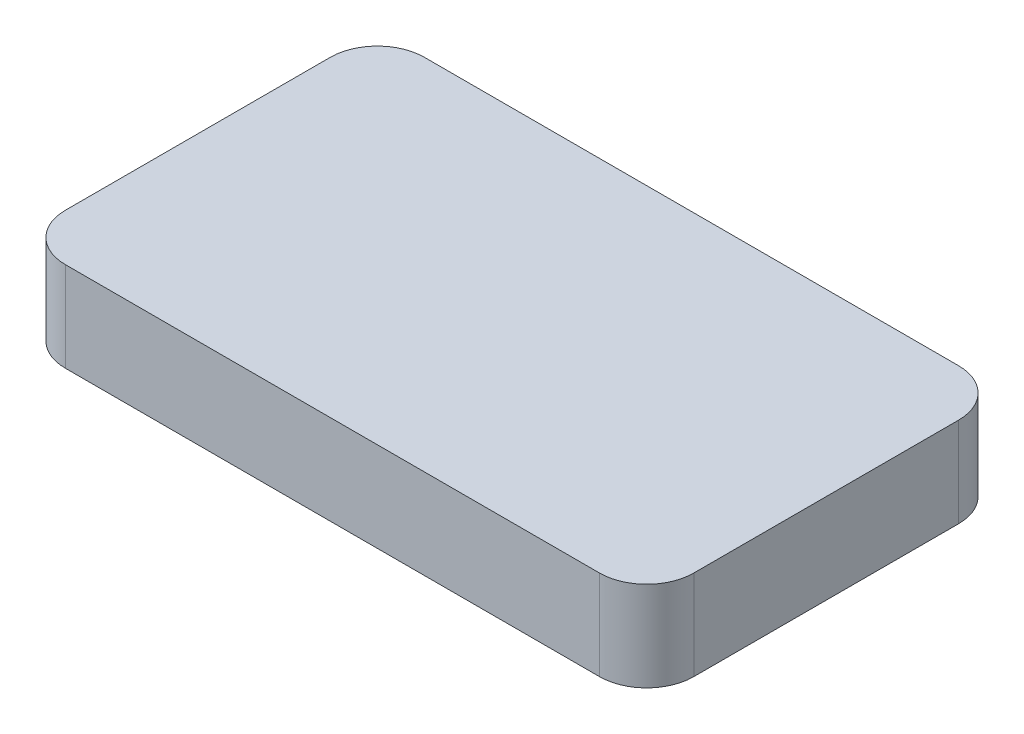
ISO-10303-21;
HEADER;
FILE_DESCRIPTION(('STEP AP214'),'2;1');
FILE_NAME('part.step','',(''),(''),'','','');
FILE_SCHEMA(('AUTOMOTIVE_DESIGN { 1 0 10303 214 1 1 1 1 }'));
ENDSEC;
DATA;
#1=APPLICATION_CONTEXT('core data for automotive mechanical design processes');
#2=APPLICATION_PROTOCOL_DEFINITION('international standard','automotive_design',2000,#1);
#3=PRODUCT_CONTEXT('',#1,'mechanical');
#4=PRODUCT('Part','Part','',(#3));
#5=PRODUCT_RELATED_PRODUCT_CATEGORY('part','',(#4));
#6=PRODUCT_DEFINITION_FORMATION('','',#4);
#7=PRODUCT_DEFINITION_CONTEXT('part definition',#1,'design');
#8=PRODUCT_DEFINITION('design','',#6,#7);
#9=PRODUCT_DEFINITION_SHAPE('','',#8);
#10=(LENGTH_UNIT() NAMED_UNIT(*) SI_UNIT(.MILLI.,.METRE.));
#11=(NAMED_UNIT(*) PLANE_ANGLE_UNIT() SI_UNIT($,.RADIAN.));
#12=(NAMED_UNIT(*) SI_UNIT($,.STERADIAN.) SOLID_ANGLE_UNIT());
#13=UNCERTAINTY_MEASURE_WITH_UNIT(LENGTH_MEASURE(1.E-05),#10,'distance_accuracy_value','');
#14=(GEOMETRIC_REPRESENTATION_CONTEXT(3) GLOBAL_UNCERTAINTY_ASSIGNED_CONTEXT((#13)) GLOBAL_UNIT_ASSIGNED_CONTEXT((#10,
#11,#12)) REPRESENTATION_CONTEXT('',''));
#15=CARTESIAN_POINT('',(0.,0.,0.));
#16=DIRECTION('',(0.,0.,1.));
#17=DIRECTION('',(1.,0.,0.));
#18=AXIS2_PLACEMENT_3D('',#15,#16,#17);
#19=CARTESIAN_POINT('',(-133.35,38.1,-76.2));
#20=DIRECTION('',(1.,0.,0.));
#21=DIRECTION('',(0.,0.,-1.));
#22=AXIS2_PLACEMENT_3D('',#19,#20,#21);
#23=PLANE('',#22);
#24=DIRECTION('',(0.,0.,1.));
#25=VECTOR('',#24,1.);
#26=CARTESIAN_POINT('',(-133.35,38.1,-76.2));
#27=LINE('',#26,#25);
#28=CARTESIAN_POINT('',(-133.35,38.1,-56.2));
#29=VERTEX_POINT('',#28);
#30=CARTESIAN_POINT('',(-133.35,38.1,56.1999999999999));
#31=VERTEX_POINT('',#30);
#32=EDGE_CURVE('E124',#29,#31,#27,.T.);
#33=ORIENTED_EDGE('',*,*,#32,.F.);
#34=DIRECTION('',(0.,-1.,0.));
#35=VECTOR('',#34,1.);
#36=CARTESIAN_POINT('',(-133.35,38.1,-56.2));
#37=LINE('',#36,#35);
#38=CARTESIAN_POINT('',(-133.35,0.,-56.2));
#39=VERTEX_POINT('',#38);
#40=EDGE_CURVE('E150',#29,#39,#37,.T.);
#41=ORIENTED_EDGE('',*,*,#40,.T.);
#42=DIRECTION('',(0.,0.,1.));
#43=VECTOR('',#42,1.);
#44=CARTESIAN_POINT('',(-133.35,0.,-76.2));
#45=LINE('',#44,#43);
#46=CARTESIAN_POINT('',(-133.35,0.,56.1999999999999));
#47=VERTEX_POINT('',#46);
#48=EDGE_CURVE('E156',#39,#47,#45,.T.);
#49=ORIENTED_EDGE('',*,*,#48,.T.);
#50=DIRECTION('',(0.,-1.,0.));
#51=VECTOR('',#50,1.);
#52=CARTESIAN_POINT('',(-133.35,38.1,56.2));
#53=LINE('',#52,#51);
#54=EDGE_CURVE('E148',#47,#31,#53,.F.);
#55=ORIENTED_EDGE('',*,*,#54,.T.);
#56=EDGE_LOOP('',(#33,#41,#49,#55));
#57=FACE_BOUND('',#56,.T.);
#58=ADVANCED_FACE('F32',(#57),#23,.F.);
#59=CARTESIAN_POINT('',(-133.35,38.1,76.2));
#60=DIRECTION('',(0.,0.,-1.));
#61=DIRECTION('',(-1.,0.,0.));
#62=AXIS2_PLACEMENT_3D('',#59,#60,#61);
#63=PLANE('',#62);
#64=DIRECTION('',(1.,0.,0.));
#65=VECTOR('',#64,1.);
#66=CARTESIAN_POINT('',(-133.35,38.1,76.2));
#67=LINE('',#66,#65);
#68=CARTESIAN_POINT('',(-113.35,38.1,76.2));
#69=VERTEX_POINT('',#68);
#70=CARTESIAN_POINT('',(113.35,38.1,76.2));
#71=VERTEX_POINT('',#70);
#72=EDGE_CURVE('E127',#69,#71,#67,.T.);
#73=ORIENTED_EDGE('',*,*,#72,.F.);
#74=DIRECTION('',(0.,-1.,0.));
#75=VECTOR('',#74,1.);
#76=CARTESIAN_POINT('',(-113.35,38.1,76.2));
#77=LINE('',#76,#75);
#78=CARTESIAN_POINT('',(-113.35,0.,76.2));
#79=VERTEX_POINT('',#78);
#80=EDGE_CURVE('E11',#69,#79,#77,.T.);
#81=ORIENTED_EDGE('',*,*,#80,.T.);
#82=DIRECTION('',(1.,0.,0.));
#83=VECTOR('',#82,1.);
#84=CARTESIAN_POINT('',(-133.35,0.,76.2));
#85=LINE('',#84,#83);
#86=CARTESIAN_POINT('',(113.35,0.,76.2));
#87=VERTEX_POINT('',#86);
#88=EDGE_CURVE('E129',#79,#87,#85,.T.);
#89=ORIENTED_EDGE('',*,*,#88,.T.);
#90=DIRECTION('',(0.,-1.,0.));
#91=VECTOR('',#90,1.);
#92=CARTESIAN_POINT('',(113.35,38.1,76.2));
#93=LINE('',#92,#91);
#94=EDGE_CURVE('E40',#87,#71,#93,.F.);
#95=ORIENTED_EDGE('',*,*,#94,.T.);
#96=EDGE_LOOP('',(#73,#81,#89,#95));
#97=FACE_BOUND('',#96,.T.);
#98=ADVANCED_FACE('F175',(#97),#63,.F.);
#99=CARTESIAN_POINT('',(133.35,38.1,-76.2));
#100=DIRECTION('',(-1.,0.,0.));
#101=DIRECTION('',(0.,0.,1.));
#102=AXIS2_PLACEMENT_3D('',#99,#100,#101);
#103=PLANE('',#102);
#104=DIRECTION('',(0.,0.,-1.));
#105=VECTOR('',#104,1.);
#106=CARTESIAN_POINT('',(133.35,0.,-76.2));
#107=LINE('',#106,#105);
#108=CARTESIAN_POINT('',(133.35,0.,56.1999999999999));
#109=VERTEX_POINT('',#108);
#110=CARTESIAN_POINT('',(133.35,0.,-56.2));
#111=VERTEX_POINT('',#110);
#112=EDGE_CURVE('E125',#109,#111,#107,.T.);
#113=ORIENTED_EDGE('',*,*,#112,.T.);
#114=DIRECTION('',(0.,-1.,0.));
#115=VECTOR('',#114,1.);
#116=CARTESIAN_POINT('',(133.35,38.1,-56.2));
#117=LINE('',#116,#115);
#118=CARTESIAN_POINT('',(133.35,38.1,-56.2));
#119=VERTEX_POINT('',#118);
#120=EDGE_CURVE('E103',#111,#119,#117,.F.);
#121=ORIENTED_EDGE('',*,*,#120,.T.);
#122=DIRECTION('',(0.,0.,-1.));
#123=VECTOR('',#122,1.);
#124=CARTESIAN_POINT('',(133.35,38.1,-76.2));
#125=LINE('',#124,#123);
#126=CARTESIAN_POINT('',(133.35,38.1,56.1999999999999));
#127=VERTEX_POINT('',#126);
#128=EDGE_CURVE('E164',#127,#119,#125,.T.);
#129=ORIENTED_EDGE('',*,*,#128,.F.);
#130=DIRECTION('',(0.,-1.,0.));
#131=VECTOR('',#130,1.);
#132=CARTESIAN_POINT('',(133.35,38.1,56.2));
#133=LINE('',#132,#131);
#134=EDGE_CURVE('E108',#127,#109,#133,.T.);
#135=ORIENTED_EDGE('',*,*,#134,.T.);
#136=EDGE_LOOP('',(#113,#121,#129,#135));
#137=FACE_BOUND('',#136,.T.);
#138=ADVANCED_FACE('F174',(#137),#103,.F.);
#139=CARTESIAN_POINT('',(-133.35,38.1,-76.2));
#140=DIRECTION('',(0.,0.,1.));
#141=DIRECTION('',(1.,0.,0.));
#142=AXIS2_PLACEMENT_3D('',#139,#140,#141);
#143=PLANE('',#142);
#144=DIRECTION('',(-1.,0.,0.));
#145=VECTOR('',#144,1.);
#146=CARTESIAN_POINT('',(-133.35,38.1,-76.2));
#147=LINE('',#146,#145);
#148=CARTESIAN_POINT('',(113.35,38.1,-76.2));
#149=VERTEX_POINT('',#148);
#150=CARTESIAN_POINT('',(-113.35,38.1,-76.2));
#151=VERTEX_POINT('',#150);
#152=EDGE_CURVE('E118',#149,#151,#147,.T.);
#153=ORIENTED_EDGE('',*,*,#152,.F.);
#154=DIRECTION('',(0.,-1.,0.));
#155=VECTOR('',#154,1.);
#156=CARTESIAN_POINT('',(113.35,38.1,-76.2));
#157=LINE('',#156,#155);
#158=CARTESIAN_POINT('',(113.35,0.,-76.2));
#159=VERTEX_POINT('',#158);
#160=EDGE_CURVE('E102',#149,#159,#157,.T.);
#161=ORIENTED_EDGE('',*,*,#160,.T.);
#162=DIRECTION('',(-1.,0.,0.));
#163=VECTOR('',#162,1.);
#164=CARTESIAN_POINT('',(-133.35,0.,-76.2));
#165=LINE('',#164,#163);
#166=CARTESIAN_POINT('',(-113.35,0.,-76.2));
#167=VERTEX_POINT('',#166);
#168=EDGE_CURVE('E115',#159,#167,#165,.T.);
#169=ORIENTED_EDGE('',*,*,#168,.T.);
#170=DIRECTION('',(0.,-1.,0.));
#171=VECTOR('',#170,1.);
#172=CARTESIAN_POINT('',(-113.35,38.1,-76.2));
#173=LINE('',#172,#171);
#174=EDGE_CURVE('E120',#167,#151,#173,.F.);
#175=ORIENTED_EDGE('',*,*,#174,.T.);
#176=EDGE_LOOP('',(#153,#161,#169,#175));
#177=FACE_BOUND('',#176,.T.);
#178=ADVANCED_FACE('F114',(#177),#143,.F.);
#179=CARTESIAN_POINT('',(0.,38.1,0.));
#180=DIRECTION('',(0.,1.,0.));
#181=DIRECTION('',(0.,0.,1.));
#182=AXIS2_PLACEMENT_3D('',#179,#180,#181);
#183=PLANE('',#182);
#184=ORIENTED_EDGE('',*,*,#128,.T.);
#185=CARTESIAN_POINT('',(113.35,38.1,-56.2));
#186=DIRECTION('',(0.,1.,0.));
#187=DIRECTION('',(0.,0.,1.));
#188=AXIS2_PLACEMENT_3D('',#185,#186,#187);
#189=CIRCLE('',#188,20.);
#190=EDGE_CURVE('E146',#119,#149,#189,.T.);
#191=ORIENTED_EDGE('',*,*,#190,.T.);
#192=ORIENTED_EDGE('',*,*,#152,.T.);
#193=CARTESIAN_POINT('',(-113.35,38.1,-56.2));
#194=DIRECTION('',(0.,1.,0.));
#195=DIRECTION('',(0.,0.,1.));
#196=AXIS2_PLACEMENT_3D('',#193,#194,#195);
#197=CIRCLE('',#196,20.);
#198=EDGE_CURVE('E144',#151,#29,#197,.T.);
#199=ORIENTED_EDGE('',*,*,#198,.T.);
#200=ORIENTED_EDGE('',*,*,#32,.T.);
#201=CARTESIAN_POINT('',(-113.35,38.1,56.2));
#202=DIRECTION('',(0.,1.,0.));
#203=DIRECTION('',(0.,0.,1.));
#204=AXIS2_PLACEMENT_3D('',#201,#202,#203);
#205=CIRCLE('',#204,20.);
#206=EDGE_CURVE('E53',#31,#69,#205,.T.);
#207=ORIENTED_EDGE('',*,*,#206,.T.);
#208=ORIENTED_EDGE('',*,*,#72,.T.);
#209=CARTESIAN_POINT('',(113.35,38.1,56.2));
#210=DIRECTION('',(0.,1.,0.));
#211=DIRECTION('',(0.,0.,1.));
#212=AXIS2_PLACEMENT_3D('',#209,#210,#211);
#213=CIRCLE('',#212,20.);
#214=EDGE_CURVE('E141',#71,#127,#213,.T.);
#215=ORIENTED_EDGE('',*,*,#214,.T.);
#216=EDGE_LOOP('',(#184,#191,#192,#199,#200,#207,#208,#215));
#217=FACE_BOUND('',#216,.T.);
#218=ADVANCED_FACE('F168',(#217),#183,.T.);
#219=CARTESIAN_POINT('',(0.,0.,0.));
#220=DIRECTION('',(0.,1.,0.));
#221=DIRECTION('',(0.,0.,1.));
#222=AXIS2_PLACEMENT_3D('',#219,#220,#221);
#223=PLANE('',#222);
#224=ORIENTED_EDGE('',*,*,#168,.F.);
#225=CARTESIAN_POINT('',(113.35,0.,-56.2));
#226=DIRECTION('',(0.,1.,0.));
#227=DIRECTION('',(0.,0.,1.));
#228=AXIS2_PLACEMENT_3D('',#225,#226,#227);
#229=CIRCLE('',#228,20.);
#230=EDGE_CURVE('E98',#159,#111,#229,.F.);
#231=ORIENTED_EDGE('',*,*,#230,.T.);
#232=ORIENTED_EDGE('',*,*,#112,.F.);
#233=CARTESIAN_POINT('',(113.35,0.,56.2));
#234=DIRECTION('',(0.,1.,0.));
#235=DIRECTION('',(0.,0.,1.));
#236=AXIS2_PLACEMENT_3D('',#233,#234,#235);
#237=CIRCLE('',#236,20.);
#238=EDGE_CURVE('E119',#109,#87,#237,.F.);
#239=ORIENTED_EDGE('',*,*,#238,.T.);
#240=ORIENTED_EDGE('',*,*,#88,.F.);
#241=CARTESIAN_POINT('',(-113.35,0.,56.2));
#242=DIRECTION('',(0.,1.,0.));
#243=DIRECTION('',(0.,0.,1.));
#244=AXIS2_PLACEMENT_3D('',#241,#242,#243);
#245=CIRCLE('',#244,20.);
#246=EDGE_CURVE('E135',#79,#47,#245,.F.);
#247=ORIENTED_EDGE('',*,*,#246,.T.);
#248=ORIENTED_EDGE('',*,*,#48,.F.);
#249=CARTESIAN_POINT('',(-113.35,0.,-56.2));
#250=DIRECTION('',(0.,1.,0.));
#251=DIRECTION('',(0.,0.,1.));
#252=AXIS2_PLACEMENT_3D('',#249,#250,#251);
#253=CIRCLE('',#252,20.);
#254=EDGE_CURVE('E109',#39,#167,#253,.F.);
#255=ORIENTED_EDGE('',*,*,#254,.T.);
#256=EDGE_LOOP('',(#224,#231,#232,#239,#240,#247,#248,#255));
#257=FACE_BOUND('',#256,.T.);
#258=ADVANCED_FACE('F122',(#257),#223,.F.);
#259=CARTESIAN_POINT('',(113.35,38.1,-56.2));
#260=DIRECTION('',(0.,-1.,0.));
#261=DIRECTION('',(0.,0.,-1.));
#262=AXIS2_PLACEMENT_3D('',#259,#260,#261);
#263=CYLINDRICAL_SURFACE('',#262,20.);
#264=ORIENTED_EDGE('',*,*,#190,.F.);
#265=ORIENTED_EDGE('',*,*,#120,.F.);
#266=ORIENTED_EDGE('',*,*,#230,.F.);
#267=ORIENTED_EDGE('',*,*,#160,.F.);
#268=EDGE_LOOP('',(#264,#265,#266,#267));
#269=FACE_BOUND('',#268,.T.);
#270=ADVANCED_FACE('F101',(#269),#263,.T.);
#271=CARTESIAN_POINT('',(-113.35,38.1,-56.2));
#272=DIRECTION('',(0.,-1.,0.));
#273=DIRECTION('',(0.,0.,-1.));
#274=AXIS2_PLACEMENT_3D('',#271,#272,#273);
#275=CYLINDRICAL_SURFACE('',#274,20.);
#276=ORIENTED_EDGE('',*,*,#198,.F.);
#277=ORIENTED_EDGE('',*,*,#174,.F.);
#278=ORIENTED_EDGE('',*,*,#254,.F.);
#279=ORIENTED_EDGE('',*,*,#40,.F.);
#280=EDGE_LOOP('',(#276,#277,#278,#279));
#281=FACE_BOUND('',#280,.T.);
#282=ADVANCED_FACE('F178',(#281),#275,.T.);
#283=CARTESIAN_POINT('',(-113.35,38.1,56.2));
#284=DIRECTION('',(0.,-1.,0.));
#285=DIRECTION('',(0.,0.,-1.));
#286=AXIS2_PLACEMENT_3D('',#283,#284,#285);
#287=CYLINDRICAL_SURFACE('',#286,20.);
#288=ORIENTED_EDGE('',*,*,#206,.F.);
#289=ORIENTED_EDGE('',*,*,#54,.F.);
#290=ORIENTED_EDGE('',*,*,#246,.F.);
#291=ORIENTED_EDGE('',*,*,#80,.F.);
#292=EDGE_LOOP('',(#288,#289,#290,#291));
#293=FACE_BOUND('',#292,.T.);
#294=ADVANCED_FACE('F177',(#293),#287,.T.);
#295=CARTESIAN_POINT('',(113.35,38.1,56.2));
#296=DIRECTION('',(0.,-1.,0.));
#297=DIRECTION('',(0.,0.,-1.));
#298=AXIS2_PLACEMENT_3D('',#295,#296,#297);
#299=CYLINDRICAL_SURFACE('',#298,20.);
#300=ORIENTED_EDGE('',*,*,#214,.F.);
#301=ORIENTED_EDGE('',*,*,#94,.F.);
#302=ORIENTED_EDGE('',*,*,#238,.F.);
#303=ORIENTED_EDGE('',*,*,#134,.F.);
#304=EDGE_LOOP('',(#300,#301,#302,#303));
#305=FACE_BOUND('',#304,.T.);
#306=ADVANCED_FACE('F34',(#305),#299,.T.);
#307=CLOSED_SHELL('',(#58,#98,#138,#178,#218,#258,#270,#282,#294,#306));
#308=MANIFOLD_SOLID_BREP('B2',#307);
#309=ADVANCED_BREP_SHAPE_REPRESENTATION('',(#18,#308),#14);
#310=SHAPE_DEFINITION_REPRESENTATION(#9,#309);
ENDSEC;
END-ISO-10303-21;
